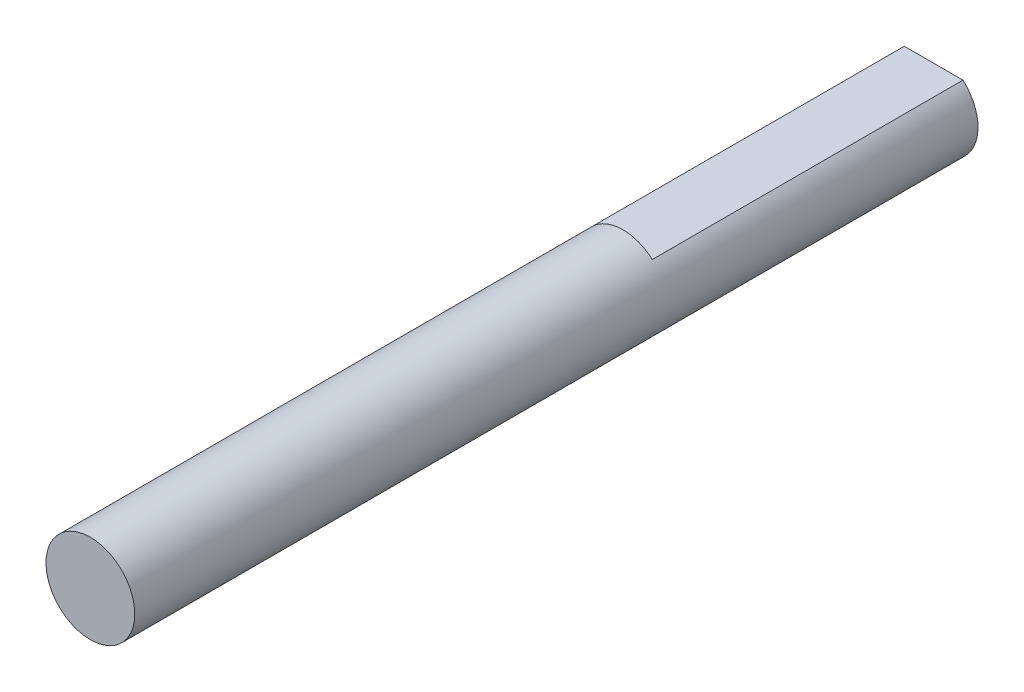
ISO-10303-21;
HEADER;
FILE_DESCRIPTION(('STEP AP214'),'2;1');
FILE_NAME('part.step','',(''),(''),'','','');
FILE_SCHEMA(('AUTOMOTIVE_DESIGN { 1 0 10303 214 1 1 1 1 }'));
ENDSEC;
DATA;
#1=APPLICATION_CONTEXT('core data for automotive mechanical design processes');
#2=APPLICATION_PROTOCOL_DEFINITION('international standard','automotive_design',2000,#1);
#3=PRODUCT_CONTEXT('',#1,'mechanical');
#4=PRODUCT('Part','Part','',(#3));
#5=PRODUCT_RELATED_PRODUCT_CATEGORY('part','',(#4));
#6=PRODUCT_DEFINITION_FORMATION('','',#4);
#7=PRODUCT_DEFINITION_CONTEXT('part definition',#1,'design');
#8=PRODUCT_DEFINITION('design','',#6,#7);
#9=PRODUCT_DEFINITION_SHAPE('','',#8);
#10=(LENGTH_UNIT() NAMED_UNIT(*) SI_UNIT(.MILLI.,.METRE.));
#11=(NAMED_UNIT(*) PLANE_ANGLE_UNIT() SI_UNIT($,.RADIAN.));
#12=(NAMED_UNIT(*) SI_UNIT($,.STERADIAN.) SOLID_ANGLE_UNIT());
#13=UNCERTAINTY_MEASURE_WITH_UNIT(LENGTH_MEASURE(1.E-05),#10,'distance_accuracy_value','');
#14=(GEOMETRIC_REPRESENTATION_CONTEXT(3) GLOBAL_UNCERTAINTY_ASSIGNED_CONTEXT((#13)) GLOBAL_UNIT_ASSIGNED_CONTEXT((#10,
#11,#12)) REPRESENTATION_CONTEXT('',''));
#15=CARTESIAN_POINT('',(0.,0.,0.));
#16=DIRECTION('',(0.,0.,1.));
#17=DIRECTION('',(1.,0.,0.));
#18=AXIS2_PLACEMENT_3D('',#15,#16,#17);
#19=CARTESIAN_POINT('',(0.,0.,0.));
#20=DIRECTION('',(0.,0.,1.));
#21=DIRECTION('',(1.,0.,0.));
#22=AXIS2_PLACEMENT_3D('',#19,#20,#21);
#23=PLANE('',#22);
#24=DIRECTION('',(1.,0.,0.));
#25=VECTOR('',#24,1.);
#26=CARTESIAN_POINT('',(0.,1.5,0.));
#27=LINE('',#26,#25);
#28=CARTESIAN_POINT('',(-1.32287565553229,1.5,0.));
#29=VERTEX_POINT('',#28);
#30=CARTESIAN_POINT('',(1.3228756555323,1.5,0.));
#31=VERTEX_POINT('',#30);
#32=EDGE_CURVE('E46',#29,#31,#27,.T.);
#33=ORIENTED_EDGE('',*,*,#32,.F.);
#34=CARTESIAN_POINT('',(0.,0.,0.));
#35=DIRECTION('',(0.,0.,1.));
#36=DIRECTION('',(1.,0.,0.));
#37=AXIS2_PLACEMENT_3D('',#34,#35,#36);
#38=CIRCLE('',#37,2.);
#39=EDGE_CURVE('E36',#31,#29,#38,.T.);
#40=ORIENTED_EDGE('',*,*,#39,.F.);
#41=EDGE_LOOP('',(#33,#40));
#42=FACE_BOUND('',#41,.T.);
#43=ADVANCED_FACE('F32',(#42),#23,.F.);
#44=CARTESIAN_POINT('',(0.,0.,24.));
#45=DIRECTION('',(0.,0.,-1.));
#46=DIRECTION('',(-1.,0.,0.));
#47=AXIS2_PLACEMENT_3D('',#44,#45,#46);
#48=CYLINDRICAL_SURFACE('',#47,2.);
#49=CARTESIAN_POINT('',(0.,0.,24.));
#50=DIRECTION('',(0.,0.,1.));
#51=DIRECTION('',(1.,0.,0.));
#52=AXIS2_PLACEMENT_3D('',#49,#50,#51);
#53=CIRCLE('',#52,2.);
#54=CARTESIAN_POINT('',(2.,0.,24.));
#55=VERTEX_POINT('',#54);
#56=EDGE_CURVE('E11',#55,#55,#53,.T.);
#57=ORIENTED_EDGE('',*,*,#56,.F.);
#58=EDGE_LOOP('',(#57));
#59=FACE_BOUND('',#58,.T.);
#60=ORIENTED_EDGE('',*,*,#39,.T.);
#61=DIRECTION('',(0.,0.,1.));
#62=VECTOR('',#61,1.);
#63=CARTESIAN_POINT('',(-1.3228756555323,1.5,-14.));
#64=LINE('',#63,#62);
#65=CARTESIAN_POINT('',(-1.3228756555323,1.5,-14.));
#66=VERTEX_POINT('',#65);
#67=EDGE_CURVE('E66',#66,#29,#64,.T.);
#68=ORIENTED_EDGE('',*,*,#67,.F.);
#69=CARTESIAN_POINT('',(0.,0.,-14.));
#70=DIRECTION('',(0.,0.,1.));
#71=DIRECTION('',(1.,0.,0.));
#72=AXIS2_PLACEMENT_3D('',#69,#70,#71);
#73=CIRCLE('',#72,2.);
#74=CARTESIAN_POINT('',(1.3228756555323,1.5,-14.));
#75=VERTEX_POINT('',#74);
#76=EDGE_CURVE('E64',#66,#75,#73,.T.);
#77=ORIENTED_EDGE('',*,*,#76,.T.);
#78=DIRECTION('',(0.,0.,1.));
#79=VECTOR('',#78,1.);
#80=CARTESIAN_POINT('',(1.3228756555323,1.5,-14.));
#81=LINE('',#80,#79);
#82=EDGE_CURVE('E62',#75,#31,#81,.T.);
#83=ORIENTED_EDGE('',*,*,#82,.T.);
#84=EDGE_LOOP('',(#60,#68,#77,#83));
#85=FACE_BOUND('',#84,.T.);
#86=ADVANCED_FACE('F34',(#59,#85),#48,.T.);
#87=CARTESIAN_POINT('',(0.,0.,24.));
#88=DIRECTION('',(0.,0.,1.));
#89=DIRECTION('',(1.,0.,0.));
#90=AXIS2_PLACEMENT_3D('',#87,#88,#89);
#91=PLANE('',#90);
#92=ORIENTED_EDGE('',*,*,#56,.T.);
#93=EDGE_LOOP('',(#92));
#94=FACE_BOUND('',#93,.T.);
#95=ADVANCED_FACE('F79',(#94),#91,.T.);
#96=CARTESIAN_POINT('',(0.,1.5,-14.));
#97=DIRECTION('',(0.,-1.,0.));
#98=DIRECTION('',(0.,0.,-1.));
#99=AXIS2_PLACEMENT_3D('',#96,#97,#98);
#100=PLANE('',#99);
#101=ORIENTED_EDGE('',*,*,#32,.T.);
#102=ORIENTED_EDGE('',*,*,#82,.F.);
#103=DIRECTION('',(1.,0.,0.));
#104=VECTOR('',#103,1.);
#105=CARTESIAN_POINT('',(0.,1.5,-14.));
#106=LINE('',#105,#104);
#107=EDGE_CURVE('E54',#66,#75,#106,.T.);
#108=ORIENTED_EDGE('',*,*,#107,.F.);
#109=ORIENTED_EDGE('',*,*,#67,.T.);
#110=EDGE_LOOP('',(#101,#102,#108,#109));
#111=FACE_BOUND('',#110,.T.);
#112=ADVANCED_FACE('F68',(#111),#100,.F.);
#113=CARTESIAN_POINT('',(0.,0.,-14.));
#114=DIRECTION('',(0.,0.,1.));
#115=DIRECTION('',(1.,0.,0.));
#116=AXIS2_PLACEMENT_3D('',#113,#114,#115);
#117=PLANE('',#116);
#118=ORIENTED_EDGE('',*,*,#107,.T.);
#119=ORIENTED_EDGE('',*,*,#76,.F.);
#120=EDGE_LOOP('',(#118,#119));
#121=FACE_BOUND('',#120,.T.);
#122=ADVANCED_FACE('F73',(#121),#117,.F.);
#123=CLOSED_SHELL('',(#43,#86,#95,#112,#122));
#124=MANIFOLD_SOLID_BREP('B2',#123);
#125=ADVANCED_BREP_SHAPE_REPRESENTATION('',(#18,#124),#14);
#126=SHAPE_DEFINITION_REPRESENTATION(#9,#125);
ENDSEC;
END-ISO-10303-21;
